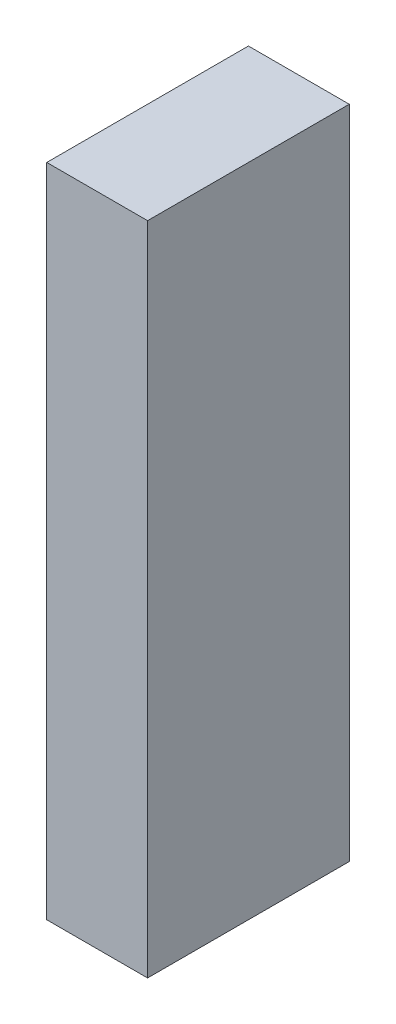
ISO-10303-21;
HEADER;
FILE_DESCRIPTION(('STEP AP214'),'2;1');
FILE_NAME('part.step','',(''),(''),'','','');
FILE_SCHEMA(('AUTOMOTIVE_DESIGN { 1 0 10303 214 1 1 1 1 }'));
ENDSEC;
DATA;
#1=APPLICATION_CONTEXT('core data for automotive mechanical design processes');
#2=APPLICATION_PROTOCOL_DEFINITION('international standard','automotive_design',2000,#1);
#3=PRODUCT_CONTEXT('',#1,'mechanical');
#4=PRODUCT('Part','Part','',(#3));
#5=PRODUCT_RELATED_PRODUCT_CATEGORY('part','',(#4));
#6=PRODUCT_DEFINITION_FORMATION('','',#4);
#7=PRODUCT_DEFINITION_CONTEXT('part definition',#1,'design');
#8=PRODUCT_DEFINITION('design','',#6,#7);
#9=PRODUCT_DEFINITION_SHAPE('','',#8);
#10=(LENGTH_UNIT() NAMED_UNIT(*) SI_UNIT(.MILLI.,.METRE.));
#11=(NAMED_UNIT(*) PLANE_ANGLE_UNIT() SI_UNIT($,.RADIAN.));
#12=(NAMED_UNIT(*) SI_UNIT($,.STERADIAN.) SOLID_ANGLE_UNIT());
#13=UNCERTAINTY_MEASURE_WITH_UNIT(LENGTH_MEASURE(1.E-05),#10,'distance_accuracy_value','');
#14=(GEOMETRIC_REPRESENTATION_CONTEXT(3) GLOBAL_UNCERTAINTY_ASSIGNED_CONTEXT((#13)) GLOBAL_UNIT_ASSIGNED_CONTEXT((#10,
#11,#12)) REPRESENTATION_CONTEXT('',''));
#15=CARTESIAN_POINT('',(0.,0.,0.));
#16=DIRECTION('',(0.,0.,1.));
#17=DIRECTION('',(1.,0.,0.));
#18=AXIS2_PLACEMENT_3D('',#15,#16,#17);
#19=CARTESIAN_POINT('',(47.8538595656998,68.1821352510018,20.));
#20=DIRECTION('',(0.,1.,0.));
#21=DIRECTION('',(0.,0.,1.));
#22=AXIS2_PLACEMENT_3D('',#19,#20,#21);
#23=PLANE('',#22);
#24=DIRECTION('',(1.,0.,0.));
#25=VECTOR('',#24,1.);
#26=CARTESIAN_POINT('',(47.8538595656998,68.1821352510018,0.));
#27=LINE('',#26,#25);
#28=CARTESIAN_POINT('',(47.8538595656998,68.1821352510018,0.));
#29=VERTEX_POINT('',#28);
#30=CARTESIAN_POINT('',(57.8538595656998,68.1821352510018,0.));
#31=VERTEX_POINT('',#30);
#32=EDGE_CURVE('E99',#29,#31,#27,.T.);
#33=ORIENTED_EDGE('',*,*,#32,.T.);
#34=DIRECTION('',(0.,0.,-1.));
#35=VECTOR('',#34,1.);
#36=CARTESIAN_POINT('',(57.8538595656998,68.1821352510018,20.));
#37=LINE('',#36,#35);
#38=CARTESIAN_POINT('',(57.8538595656998,68.1821352510018,20.));
#39=VERTEX_POINT('',#38);
#40=EDGE_CURVE('E11',#39,#31,#37,.T.);
#41=ORIENTED_EDGE('',*,*,#40,.F.);
#42=DIRECTION('',(1.,0.,0.));
#43=VECTOR('',#42,1.);
#44=CARTESIAN_POINT('',(47.8538595656998,68.1821352510018,20.));
#45=LINE('',#44,#43);
#46=CARTESIAN_POINT('',(47.8538595656998,68.1821352510018,20.));
#47=VERTEX_POINT('',#46);
#48=EDGE_CURVE('E87',#47,#39,#45,.T.);
#49=ORIENTED_EDGE('',*,*,#48,.F.);
#50=DIRECTION('',(0.,0.,-1.));
#51=VECTOR('',#50,1.);
#52=CARTESIAN_POINT('',(47.8538595656998,68.1821352510018,20.));
#53=LINE('',#52,#51);
#54=EDGE_CURVE('E95',#47,#29,#53,.T.);
#55=ORIENTED_EDGE('',*,*,#54,.T.);
#56=EDGE_LOOP('',(#33,#41,#49,#55));
#57=FACE_BOUND('',#56,.T.);
#58=ADVANCED_FACE('F36',(#57),#23,.F.);
#59=CARTESIAN_POINT('',(57.8538595656998,68.1821352510018,20.));
#60=DIRECTION('',(-1.,0.,0.));
#61=DIRECTION('',(0.,0.,1.));
#62=AXIS2_PLACEMENT_3D('',#59,#60,#61);
#63=PLANE('',#62);
#64=DIRECTION('',(0.,1.,0.));
#65=VECTOR('',#64,1.);
#66=CARTESIAN_POINT('',(57.8538595656998,68.1821352510018,0.));
#67=LINE('',#66,#65);
#68=CARTESIAN_POINT('',(57.8538595656998,133.228481613816,0.));
#69=VERTEX_POINT('',#68);
#70=EDGE_CURVE('E91',#31,#69,#67,.T.);
#71=ORIENTED_EDGE('',*,*,#70,.T.);
#72=DIRECTION('',(0.,0.,-1.));
#73=VECTOR('',#72,1.);
#74=CARTESIAN_POINT('',(57.8538595656998,133.228481613816,20.));
#75=LINE('',#74,#73);
#76=CARTESIAN_POINT('',(57.8538595656998,133.228481613816,20.));
#77=VERTEX_POINT('',#76);
#78=EDGE_CURVE('E44',#77,#69,#75,.T.);
#79=ORIENTED_EDGE('',*,*,#78,.F.);
#80=DIRECTION('',(0.,1.,0.));
#81=VECTOR('',#80,1.);
#82=CARTESIAN_POINT('',(57.8538595656998,68.1821352510018,20.));
#83=LINE('',#82,#81);
#84=EDGE_CURVE('E82',#39,#77,#83,.T.);
#85=ORIENTED_EDGE('',*,*,#84,.F.);
#86=ORIENTED_EDGE('',*,*,#40,.T.);
#87=EDGE_LOOP('',(#71,#79,#85,#86));
#88=FACE_BOUND('',#87,.T.);
#89=ADVANCED_FACE('F90',(#88),#63,.F.);
#90=CARTESIAN_POINT('',(57.8538595656998,133.228481613816,20.));
#91=DIRECTION('',(0.,-1.,0.));
#92=DIRECTION('',(0.,0.,-1.));
#93=AXIS2_PLACEMENT_3D('',#90,#91,#92);
#94=PLANE('',#93);
#95=DIRECTION('',(-1.,0.,0.));
#96=VECTOR('',#95,1.);
#97=CARTESIAN_POINT('',(57.8538595656998,133.228481613816,0.));
#98=LINE('',#97,#96);
#99=CARTESIAN_POINT('',(47.8538595656998,133.228481613816,0.));
#100=VERTEX_POINT('',#99);
#101=EDGE_CURVE('E69',#69,#100,#98,.T.);
#102=ORIENTED_EDGE('',*,*,#101,.T.);
#103=DIRECTION('',(0.,0.,-1.));
#104=VECTOR('',#103,1.);
#105=CARTESIAN_POINT('',(47.8538595656998,133.228481613816,20.));
#106=LINE('',#105,#104);
#107=CARTESIAN_POINT('',(47.8538595656998,133.228481613816,20.));
#108=VERTEX_POINT('',#107);
#109=EDGE_CURVE('E92',#108,#100,#106,.T.);
#110=ORIENTED_EDGE('',*,*,#109,.F.);
#111=DIRECTION('',(-1.,0.,0.));
#112=VECTOR('',#111,1.);
#113=CARTESIAN_POINT('',(57.8538595656998,133.228481613816,20.));
#114=LINE('',#113,#112);
#115=EDGE_CURVE('E85',#77,#108,#114,.T.);
#116=ORIENTED_EDGE('',*,*,#115,.F.);
#117=ORIENTED_EDGE('',*,*,#78,.T.);
#118=EDGE_LOOP('',(#102,#110,#116,#117));
#119=FACE_BOUND('',#118,.T.);
#120=ADVANCED_FACE('F93',(#119),#94,.F.);
#121=CARTESIAN_POINT('',(47.8538595656998,133.228481613816,20.));
#122=DIRECTION('',(1.,0.,0.));
#123=DIRECTION('',(0.,0.,-1.));
#124=AXIS2_PLACEMENT_3D('',#121,#122,#123);
#125=PLANE('',#124);
#126=DIRECTION('',(0.,-1.,0.));
#127=VECTOR('',#126,1.);
#128=CARTESIAN_POINT('',(47.8538595656998,133.228481613816,0.));
#129=LINE('',#128,#127);
#130=EDGE_CURVE('E75',#100,#29,#129,.T.);
#131=ORIENTED_EDGE('',*,*,#130,.T.);
#132=ORIENTED_EDGE('',*,*,#54,.F.);
#133=DIRECTION('',(0.,-1.,0.));
#134=VECTOR('',#133,1.);
#135=CARTESIAN_POINT('',(47.8538595656998,133.228481613816,20.));
#136=LINE('',#135,#134);
#137=EDGE_CURVE('E52',#108,#47,#136,.T.);
#138=ORIENTED_EDGE('',*,*,#137,.F.);
#139=ORIENTED_EDGE('',*,*,#109,.T.);
#140=EDGE_LOOP('',(#131,#132,#138,#139));
#141=FACE_BOUND('',#140,.T.);
#142=ADVANCED_FACE('F106',(#141),#125,.F.);
#143=CARTESIAN_POINT('',(0.,0.,20.));
#144=DIRECTION('',(0.,0.,1.));
#145=DIRECTION('',(1.,0.,0.));
#146=AXIS2_PLACEMENT_3D('',#143,#144,#145);
#147=PLANE('',#146);
#148=ORIENTED_EDGE('',*,*,#48,.T.);
#149=ORIENTED_EDGE('',*,*,#84,.T.);
#150=ORIENTED_EDGE('',*,*,#115,.T.);
#151=ORIENTED_EDGE('',*,*,#137,.T.);
#152=EDGE_LOOP('',(#148,#149,#150,#151));
#153=FACE_BOUND('',#152,.T.);
#154=ADVANCED_FACE('F83',(#153),#147,.T.);
#155=CARTESIAN_POINT('',(0.,0.,0.));
#156=DIRECTION('',(0.,0.,1.));
#157=DIRECTION('',(1.,0.,0.));
#158=AXIS2_PLACEMENT_3D('',#155,#156,#157);
#159=PLANE('',#158);
#160=ORIENTED_EDGE('',*,*,#32,.F.);
#161=ORIENTED_EDGE('',*,*,#130,.F.);
#162=ORIENTED_EDGE('',*,*,#101,.F.);
#163=ORIENTED_EDGE('',*,*,#70,.F.);
#164=EDGE_LOOP('',(#160,#161,#162,#163));
#165=FACE_BOUND('',#164,.T.);
#166=ADVANCED_FACE('F109',(#165),#159,.F.);
#167=CLOSED_SHELL('',(#58,#89,#120,#142,#154,#166));
#168=MANIFOLD_SOLID_BREP('B2',#167);
#169=ADVANCED_BREP_SHAPE_REPRESENTATION('',(#18,#168),#14);
#170=SHAPE_DEFINITION_REPRESENTATION(#9,#169);
ENDSEC;
END-ISO-10303-21;
